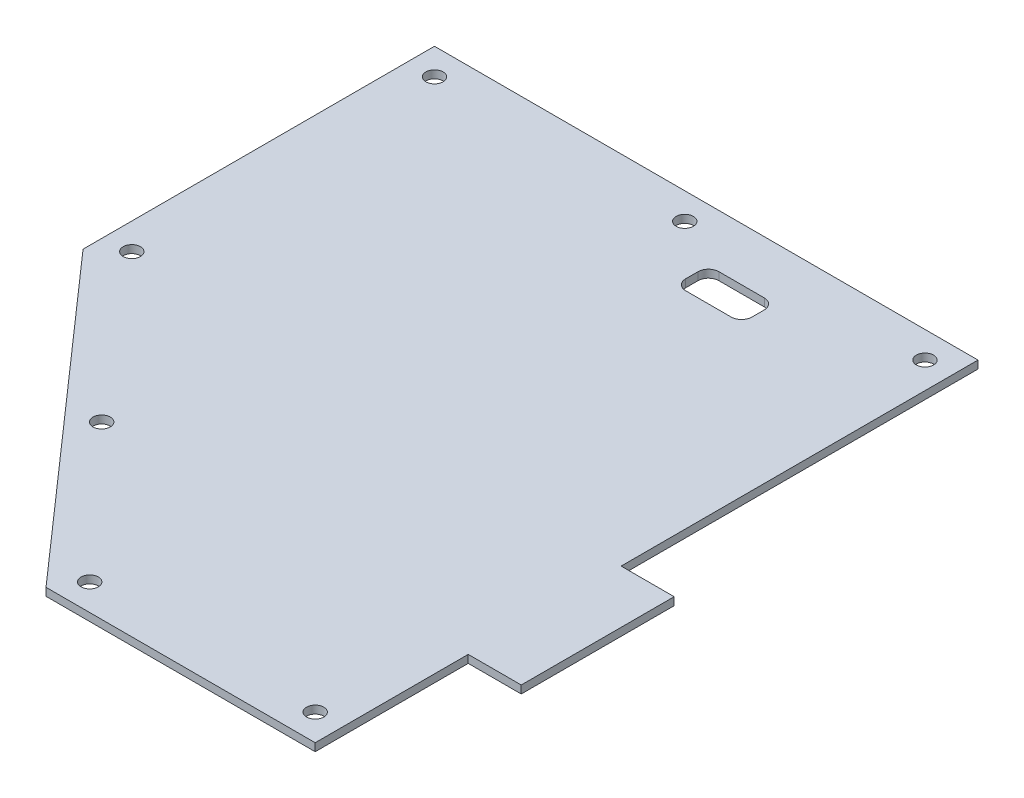
ISO-10303-21;
HEADER;
FILE_DESCRIPTION(('STEP AP214'),'2;1');
FILE_NAME('part.step','',(''),(''),'','','');
FILE_SCHEMA(('AUTOMOTIVE_DESIGN { 1 0 10303 214 1 1 1 1 }'));
ENDSEC;
DATA;
#1=APPLICATION_CONTEXT('core data for automotive mechanical design processes');
#2=APPLICATION_PROTOCOL_DEFINITION('international standard','automotive_design',2000,#1);
#3=PRODUCT_CONTEXT('',#1,'mechanical');
#4=PRODUCT('Part','Part','',(#3));
#5=PRODUCT_RELATED_PRODUCT_CATEGORY('part','',(#4));
#6=PRODUCT_DEFINITION_FORMATION('','',#4);
#7=PRODUCT_DEFINITION_CONTEXT('part definition',#1,'design');
#8=PRODUCT_DEFINITION('design','',#6,#7);
#9=PRODUCT_DEFINITION_SHAPE('','',#8);
#10=(LENGTH_UNIT() NAMED_UNIT(*) SI_UNIT(.MILLI.,.METRE.));
#11=(NAMED_UNIT(*) PLANE_ANGLE_UNIT() SI_UNIT($,.RADIAN.));
#12=(NAMED_UNIT(*) SI_UNIT($,.STERADIAN.) SOLID_ANGLE_UNIT());
#13=UNCERTAINTY_MEASURE_WITH_UNIT(LENGTH_MEASURE(1.E-05),#10,'distance_accuracy_value','');
#14=(GEOMETRIC_REPRESENTATION_CONTEXT(3) GLOBAL_UNCERTAINTY_ASSIGNED_CONTEXT((#13)) GLOBAL_UNIT_ASSIGNED_CONTEXT((#10,
#11,#12)) REPRESENTATION_CONTEXT('',''));
#15=CARTESIAN_POINT('',(0.,0.,0.));
#16=DIRECTION('',(0.,0.,1.));
#17=DIRECTION('',(1.,0.,0.));
#18=AXIS2_PLACEMENT_3D('',#15,#16,#17);
#19=CARTESIAN_POINT('',(0.,1.5,0.));
#20=DIRECTION('',(1.,0.,0.));
#21=DIRECTION('',(0.,0.,-1.));
#22=AXIS2_PLACEMENT_3D('',#19,#20,#21);
#23=PLANE('',#22);
#24=DIRECTION('',(0.,0.,1.));
#25=VECTOR('',#24,1.);
#26=CARTESIAN_POINT('',(0.,0.,0.));
#27=LINE('',#26,#25);
#28=CARTESIAN_POINT('',(0.,0.,0.));
#29=VERTEX_POINT('',#28);
#30=CARTESIAN_POINT('',(0.,0.,67.34));
#31=VERTEX_POINT('',#30);
#32=EDGE_CURVE('E178',#29,#31,#27,.T.);
#33=ORIENTED_EDGE('',*,*,#32,.T.);
#34=DIRECTION('',(0.,-1.,0.));
#35=VECTOR('',#34,1.);
#36=CARTESIAN_POINT('',(0.,1.5,67.34));
#37=LINE('',#36,#35);
#38=CARTESIAN_POINT('',(0.,1.5,67.34));
#39=VERTEX_POINT('',#38);
#40=EDGE_CURVE('E159',#39,#31,#37,.T.);
#41=ORIENTED_EDGE('',*,*,#40,.F.);
#42=DIRECTION('',(0.,0.,1.));
#43=VECTOR('',#42,1.);
#44=CARTESIAN_POINT('',(0.,1.5,0.));
#45=LINE('',#44,#43);
#46=CARTESIAN_POINT('',(0.,1.5,0.));
#47=VERTEX_POINT('',#46);
#48=EDGE_CURVE('E166',#47,#39,#45,.T.);
#49=ORIENTED_EDGE('',*,*,#48,.F.);
#50=DIRECTION('',(0.,-1.,0.));
#51=VECTOR('',#50,1.);
#52=CARTESIAN_POINT('',(0.,1.5,0.));
#53=LINE('',#52,#51);
#54=EDGE_CURVE('E296',#47,#29,#53,.T.);
#55=ORIENTED_EDGE('',*,*,#54,.T.);
#56=EDGE_LOOP('',(#33,#41,#49,#55));
#57=FACE_BOUND('',#56,.T.);
#58=ADVANCED_FACE('F36',(#57),#23,.F.);
#59=CARTESIAN_POINT('',(0.,1.5,67.34));
#60=DIRECTION('',(0.750341865315039,0.,-0.661049986881134));
#61=DIRECTION('',(-0.661049986881134,0.,-0.75034186531504));
#62=AXIS2_PLACEMENT_3D('',#59,#60,#61);
#63=PLANE('',#62);
#64=DIRECTION('',(0.661049986881134,0.,0.75034186531504));
#65=VECTOR('',#64,1.);
#66=CARTESIAN_POINT('',(0.,0.,67.34));
#67=LINE('',#66,#65);
#68=CARTESIAN_POINT('',(52.560084456919,0.,126.999681711199));
#69=VERTEX_POINT('',#68);
#70=EDGE_CURVE('E298',#31,#69,#67,.T.);
#71=ORIENTED_EDGE('',*,*,#70,.T.);
#72=DIRECTION('',(0.,-1.,0.));
#73=VECTOR('',#72,1.);
#74=CARTESIAN_POINT('',(52.560084456919,1.5,126.999681711199));
#75=LINE('',#74,#73);
#76=CARTESIAN_POINT('',(52.560084456919,1.5,126.999681711199));
#77=VERTEX_POINT('',#76);
#78=EDGE_CURVE('E162',#77,#69,#75,.T.);
#79=ORIENTED_EDGE('',*,*,#78,.F.);
#80=DIRECTION('',(0.661049986881134,0.,0.75034186531504));
#81=VECTOR('',#80,1.);
#82=CARTESIAN_POINT('',(0.,1.5,67.34));
#83=LINE('',#82,#81);
#84=EDGE_CURVE('E155',#39,#77,#83,.T.);
#85=ORIENTED_EDGE('',*,*,#84,.F.);
#86=ORIENTED_EDGE('',*,*,#40,.T.);
#87=EDGE_LOOP('',(#71,#79,#85,#86));
#88=FACE_BOUND('',#87,.T.);
#89=ADVANCED_FACE('F157',(#88),#63,.F.);
#90=CARTESIAN_POINT('',(104.140084456919,1.5,126.999681711199));
#91=DIRECTION('',(0.,0.,-1.));
#92=DIRECTION('',(-1.,0.,0.));
#93=AXIS2_PLACEMENT_3D('',#90,#91,#92);
#94=PLANE('',#93);
#95=DIRECTION('',(1.,0.,0.));
#96=VECTOR('',#95,1.);
#97=CARTESIAN_POINT('',(104.140084456919,0.,126.999681711199));
#98=LINE('',#97,#96);
#99=CARTESIAN_POINT('',(104.140084456919,0.,126.999681711199));
#100=VERTEX_POINT('',#99);
#101=EDGE_CURVE('E300',#69,#100,#98,.T.);
#102=ORIENTED_EDGE('',*,*,#101,.T.);
#103=DIRECTION('',(0.,-1.,0.));
#104=VECTOR('',#103,1.);
#105=CARTESIAN_POINT('',(104.140084456919,1.5,126.999681711199));
#106=LINE('',#105,#104);
#107=CARTESIAN_POINT('',(104.140084456919,1.5,126.999681711199));
#108=VERTEX_POINT('',#107);
#109=EDGE_CURVE('E183',#108,#100,#106,.T.);
#110=ORIENTED_EDGE('',*,*,#109,.F.);
#111=DIRECTION('',(1.,0.,0.));
#112=VECTOR('',#111,1.);
#113=CARTESIAN_POINT('',(104.140084456919,1.5,126.999681711199));
#114=LINE('',#113,#112);
#115=EDGE_CURVE('E165',#77,#108,#114,.T.);
#116=ORIENTED_EDGE('',*,*,#115,.F.);
#117=ORIENTED_EDGE('',*,*,#78,.T.);
#118=EDGE_LOOP('',(#102,#110,#116,#117));
#119=FACE_BOUND('',#118,.T.);
#120=ADVANCED_FACE('F352',(#119),#94,.F.);
#121=CARTESIAN_POINT('',(104.140084456919,1.5,97.6796817111988));
#122=DIRECTION('',(-1.,0.,0.));
#123=DIRECTION('',(0.,0.,1.));
#124=AXIS2_PLACEMENT_3D('',#121,#122,#123);
#125=PLANE('',#124);
#126=DIRECTION('',(0.,0.,-1.));
#127=VECTOR('',#126,1.);
#128=CARTESIAN_POINT('',(104.140084456919,0.,97.6796817111988));
#129=LINE('',#128,#127);
#130=CARTESIAN_POINT('',(104.140084456919,0.,97.6796817111988));
#131=VERTEX_POINT('',#130);
#132=EDGE_CURVE('E302',#100,#131,#129,.T.);
#133=ORIENTED_EDGE('',*,*,#132,.T.);
#134=DIRECTION('',(0.,-1.,0.));
#135=VECTOR('',#134,1.);
#136=CARTESIAN_POINT('',(104.140084456919,1.5,97.6796817111988));
#137=LINE('',#136,#135);
#138=CARTESIAN_POINT('',(104.140084456919,1.5,97.6796817111988));
#139=VERTEX_POINT('',#138);
#140=EDGE_CURVE('E326',#139,#131,#137,.T.);
#141=ORIENTED_EDGE('',*,*,#140,.F.);
#142=DIRECTION('',(0.,0.,-1.));
#143=VECTOR('',#142,1.);
#144=CARTESIAN_POINT('',(104.140084456919,1.5,97.6796817111988));
#145=LINE('',#144,#143);
#146=EDGE_CURVE('E285',#108,#139,#145,.T.);
#147=ORIENTED_EDGE('',*,*,#146,.F.);
#148=ORIENTED_EDGE('',*,*,#109,.T.);
#149=EDGE_LOOP('',(#133,#141,#147,#148));
#150=FACE_BOUND('',#149,.T.);
#151=ADVANCED_FACE('F333',(#150),#125,.F.);
#152=CARTESIAN_POINT('',(104.140084456919,1.5,97.6796817111988));
#153=DIRECTION('',(0.,0.,-1.));
#154=DIRECTION('',(-1.,0.,0.));
#155=AXIS2_PLACEMENT_3D('',#152,#153,#154);
#156=PLANE('',#155);
#157=DIRECTION('',(1.,0.,0.));
#158=VECTOR('',#157,1.);
#159=CARTESIAN_POINT('',(104.140084456919,0.,97.6796817111988));
#160=LINE('',#159,#158);
#161=CARTESIAN_POINT('',(114.300084456919,0.,97.6796817111988));
#162=VERTEX_POINT('',#161);
#163=EDGE_CURVE('E304',#131,#162,#160,.T.);
#164=ORIENTED_EDGE('',*,*,#163,.T.);
#165=DIRECTION('',(0.,-1.,0.));
#166=VECTOR('',#165,1.);
#167=CARTESIAN_POINT('',(114.300084456919,1.5,97.6796817111988));
#168=LINE('',#167,#166);
#169=CARTESIAN_POINT('',(114.300084456919,1.5,97.6796817111988));
#170=VERTEX_POINT('',#169);
#171=EDGE_CURVE('E323',#170,#162,#168,.T.);
#172=ORIENTED_EDGE('',*,*,#171,.F.);
#173=DIRECTION('',(1.,0.,0.));
#174=VECTOR('',#173,1.);
#175=CARTESIAN_POINT('',(104.140084456919,1.5,97.6796817111988));
#176=LINE('',#175,#174);
#177=EDGE_CURVE('E287',#139,#170,#176,.T.);
#178=ORIENTED_EDGE('',*,*,#177,.F.);
#179=ORIENTED_EDGE('',*,*,#140,.T.);
#180=EDGE_LOOP('',(#164,#172,#178,#179));
#181=FACE_BOUND('',#180,.T.);
#182=ADVANCED_FACE('F344',(#181),#156,.F.);
#183=CARTESIAN_POINT('',(114.300084456919,1.5,97.6796817111988));
#184=DIRECTION('',(-1.,0.,0.));
#185=DIRECTION('',(0.,0.,1.));
#186=AXIS2_PLACEMENT_3D('',#183,#184,#185);
#187=PLANE('',#186);
#188=DIRECTION('',(0.,0.,-1.));
#189=VECTOR('',#188,1.);
#190=CARTESIAN_POINT('',(114.300084456919,0.,97.6796817111988));
#191=LINE('',#190,#189);
#192=CARTESIAN_POINT('',(114.300084456919,0.,68.3796817111988));
#193=VERTEX_POINT('',#192);
#194=EDGE_CURVE('E306',#162,#193,#191,.T.);
#195=ORIENTED_EDGE('',*,*,#194,.T.);
#196=DIRECTION('',(0.,-1.,0.));
#197=VECTOR('',#196,1.);
#198=CARTESIAN_POINT('',(114.300084456919,1.5,68.3796817111988));
#199=LINE('',#198,#197);
#200=CARTESIAN_POINT('',(114.300084456919,1.5,68.3796817111988));
#201=VERTEX_POINT('',#200);
#202=EDGE_CURVE('E320',#201,#193,#199,.T.);
#203=ORIENTED_EDGE('',*,*,#202,.F.);
#204=DIRECTION('',(0.,0.,-1.));
#205=VECTOR('',#204,1.);
#206=CARTESIAN_POINT('',(114.300084456919,1.5,97.6796817111988));
#207=LINE('',#206,#205);
#208=EDGE_CURVE('E289',#170,#201,#207,.T.);
#209=ORIENTED_EDGE('',*,*,#208,.F.);
#210=ORIENTED_EDGE('',*,*,#171,.T.);
#211=EDGE_LOOP('',(#195,#203,#209,#210));
#212=FACE_BOUND('',#211,.T.);
#213=ADVANCED_FACE('F348',(#212),#187,.F.);
#214=CARTESIAN_POINT('',(104.140084456919,1.5,68.3796817111988));
#215=DIRECTION('',(0.,0.,1.));
#216=DIRECTION('',(1.,0.,0.));
#217=AXIS2_PLACEMENT_3D('',#214,#215,#216);
#218=PLANE('',#217);
#219=DIRECTION('',(-1.,0.,0.));
#220=VECTOR('',#219,1.);
#221=CARTESIAN_POINT('',(104.140084456919,0.,68.3796817111988));
#222=LINE('',#221,#220);
#223=CARTESIAN_POINT('',(104.140084456919,0.,68.3796817111988));
#224=VERTEX_POINT('',#223);
#225=EDGE_CURVE('E308',#193,#224,#222,.T.);
#226=ORIENTED_EDGE('',*,*,#225,.T.);
#227=DIRECTION('',(0.,-1.,0.));
#228=VECTOR('',#227,1.);
#229=CARTESIAN_POINT('',(104.140084456919,1.5,68.3796817111988));
#230=LINE('',#229,#228);
#231=CARTESIAN_POINT('',(104.140084456919,1.5,68.3796817111988));
#232=VERTEX_POINT('',#231);
#233=EDGE_CURVE('E317',#232,#224,#230,.T.);
#234=ORIENTED_EDGE('',*,*,#233,.F.);
#235=DIRECTION('',(-1.,0.,0.));
#236=VECTOR('',#235,1.);
#237=CARTESIAN_POINT('',(104.140084456919,1.5,68.3796817111988));
#238=LINE('',#237,#236);
#239=EDGE_CURVE('E291',#201,#232,#238,.T.);
#240=ORIENTED_EDGE('',*,*,#239,.F.);
#241=ORIENTED_EDGE('',*,*,#202,.T.);
#242=EDGE_LOOP('',(#226,#234,#240,#241));
#243=FACE_BOUND('',#242,.T.);
#244=ADVANCED_FACE('F448',(#243),#218,.F.);
#245=CARTESIAN_POINT('',(104.14,1.5,0.));
#246=DIRECTION('',(-0.999999999999237,0.,1.2351171705755E-06));
#247=DIRECTION('',(1.2351171705755E-06,0.,0.999999999999237));
#248=AXIS2_PLACEMENT_3D('',#245,#246,#247);
#249=PLANE('',#248);
#250=DIRECTION('',(-1.2351171705755E-06,0.,-0.999999999999237));
#251=VECTOR('',#250,1.);
#252=CARTESIAN_POINT('',(104.14,0.,0.));
#253=LINE('',#252,#251);
#254=CARTESIAN_POINT('',(104.14,0.,0.));
#255=VERTEX_POINT('',#254);
#256=EDGE_CURVE('E310',#224,#255,#253,.T.);
#257=ORIENTED_EDGE('',*,*,#256,.T.);
#258=DIRECTION('',(0.,-1.,0.));
#259=VECTOR('',#258,1.);
#260=CARTESIAN_POINT('',(104.14,1.5,0.));
#261=LINE('',#260,#259);
#262=CARTESIAN_POINT('',(104.14,1.5,0.));
#263=VERTEX_POINT('',#262);
#264=EDGE_CURVE('E314',#263,#255,#261,.T.);
#265=ORIENTED_EDGE('',*,*,#264,.F.);
#266=DIRECTION('',(-1.2351171705755E-06,0.,-0.999999999999237));
#267=VECTOR('',#266,1.);
#268=CARTESIAN_POINT('',(104.14,1.5,0.));
#269=LINE('',#268,#267);
#270=EDGE_CURVE('E293',#232,#263,#269,.T.);
#271=ORIENTED_EDGE('',*,*,#270,.F.);
#272=ORIENTED_EDGE('',*,*,#233,.T.);
#273=EDGE_LOOP('',(#257,#265,#271,#272));
#274=FACE_BOUND('',#273,.T.);
#275=ADVANCED_FACE('F444',(#274),#249,.F.);
#276=CARTESIAN_POINT('',(0.,1.5,0.));
#277=DIRECTION('',(0.,0.,1.));
#278=DIRECTION('',(1.,0.,0.));
#279=AXIS2_PLACEMENT_3D('',#276,#277,#278);
#280=PLANE('',#279);
#281=DIRECTION('',(-1.,0.,0.));
#282=VECTOR('',#281,1.);
#283=CARTESIAN_POINT('',(0.,0.,0.));
#284=LINE('',#283,#282);
#285=EDGE_CURVE('E175',#255,#29,#284,.T.);
#286=ORIENTED_EDGE('',*,*,#285,.T.);
#287=ORIENTED_EDGE('',*,*,#54,.F.);
#288=DIRECTION('',(-1.,0.,0.));
#289=VECTOR('',#288,1.);
#290=CARTESIAN_POINT('',(0.,1.5,0.));
#291=LINE('',#290,#289);
#292=EDGE_CURVE('E171',#263,#47,#291,.T.);
#293=ORIENTED_EDGE('',*,*,#292,.F.);
#294=ORIENTED_EDGE('',*,*,#264,.T.);
#295=EDGE_LOOP('',(#286,#287,#293,#294));
#296=FACE_BOUND('',#295,.T.);
#297=ADVANCED_FACE('F439',(#296),#280,.F.);
#298=CARTESIAN_POINT('',(0.,1.5,0.));
#299=DIRECTION('',(0.,-1.,0.));
#300=DIRECTION('',(0.,0.,-1.));
#301=AXIS2_PLACEMENT_3D('',#298,#299,#300);
#302=PLANE('',#301);
#303=DIRECTION('',(0.,0.,1.));
#304=VECTOR('',#303,1.);
#305=CARTESIAN_POINT('',(62.65,1.5,10.16));
#306=LINE('',#305,#304);
#307=CARTESIAN_POINT('',(62.65,1.5,12.16));
#308=VERTEX_POINT('',#307);
#309=CARTESIAN_POINT('',(62.65,1.5,14.51));
#310=VERTEX_POINT('',#309);
#311=EDGE_CURVE('E219',#308,#310,#306,.T.);
#312=ORIENTED_EDGE('',*,*,#311,.F.);
#313=CARTESIAN_POINT('',(64.65,1.5,12.16));
#314=DIRECTION('',(0.,-1.,0.));
#315=DIRECTION('',(0.,0.,-1.));
#316=AXIS2_PLACEMENT_3D('',#313,#314,#315);
#317=CIRCLE('',#316,2.);
#318=CARTESIAN_POINT('',(64.65,1.5,10.16));
#319=VERTEX_POINT('',#318);
#320=EDGE_CURVE('E203',#308,#319,#317,.T.);
#321=ORIENTED_EDGE('',*,*,#320,.T.);
#322=DIRECTION('',(-1.,0.,0.));
#323=VECTOR('',#322,1.);
#324=CARTESIAN_POINT('',(62.65,1.5,10.16));
#325=LINE('',#324,#323);
#326=CARTESIAN_POINT('',(73.35,1.5,10.16));
#327=VERTEX_POINT('',#326);
#328=EDGE_CURVE('E228',#327,#319,#325,.T.);
#329=ORIENTED_EDGE('',*,*,#328,.F.);
#330=CARTESIAN_POINT('',(73.35,1.5,12.16));
#331=DIRECTION('',(0.,-1.,0.));
#332=DIRECTION('',(0.,0.,-1.));
#333=AXIS2_PLACEMENT_3D('',#330,#331,#332);
#334=CIRCLE('',#333,2.);
#335=CARTESIAN_POINT('',(75.35,1.5,12.16));
#336=VERTEX_POINT('',#335);
#337=EDGE_CURVE('E207',#327,#336,#334,.T.);
#338=ORIENTED_EDGE('',*,*,#337,.T.);
#339=DIRECTION('',(0.,0.,-1.));
#340=VECTOR('',#339,1.);
#341=CARTESIAN_POINT('',(75.35,1.5,10.16));
#342=LINE('',#341,#340);
#343=CARTESIAN_POINT('',(75.35,1.5,14.51));
#344=VERTEX_POINT('',#343);
#345=EDGE_CURVE('E388',#344,#336,#342,.T.);
#346=ORIENTED_EDGE('',*,*,#345,.F.);
#347=CARTESIAN_POINT('',(73.35,1.5,14.51));
#348=DIRECTION('',(0.,-1.,0.));
#349=DIRECTION('',(0.,0.,-1.));
#350=AXIS2_PLACEMENT_3D('',#347,#348,#349);
#351=CIRCLE('',#350,2.);
#352=CARTESIAN_POINT('',(73.35,1.5,16.51));
#353=VERTEX_POINT('',#352);
#354=EDGE_CURVE('E211',#344,#353,#351,.T.);
#355=ORIENTED_EDGE('',*,*,#354,.T.);
#356=DIRECTION('',(1.,0.,0.));
#357=VECTOR('',#356,1.);
#358=CARTESIAN_POINT('',(62.65,1.5,16.51));
#359=LINE('',#358,#357);
#360=CARTESIAN_POINT('',(64.65,1.5,16.51));
#361=VERTEX_POINT('',#360);
#362=EDGE_CURVE('E220',#361,#353,#359,.T.);
#363=ORIENTED_EDGE('',*,*,#362,.F.);
#364=CARTESIAN_POINT('',(64.65,1.5,14.51));
#365=DIRECTION('',(0.,-1.,0.));
#366=DIRECTION('',(0.,0.,-1.));
#367=AXIS2_PLACEMENT_3D('',#364,#365,#366);
#368=CIRCLE('',#367,2.);
#369=EDGE_CURVE('E44',#361,#310,#368,.T.);
#370=ORIENTED_EDGE('',*,*,#369,.T.);
#371=EDGE_LOOP('',(#312,#321,#329,#338,#346,#355,#363,#370));
#372=FACE_BOUND('',#371,.T.);
#373=CARTESIAN_POINT('',(5.08,1.5,5.08));
#374=DIRECTION('',(0.,1.,0.));
#375=DIRECTION('',(0.,0.,1.));
#376=AXIS2_PLACEMENT_3D('',#373,#374,#375);
#377=CIRCLE('',#376,1.64999999999999);
#378=CARTESIAN_POINT('',(5.08,1.5,6.72999999999999));
#379=VERTEX_POINT('',#378);
#380=EDGE_CURVE('E237',#379,#379,#377,.T.);
#381=ORIENTED_EDGE('',*,*,#380,.F.);
#382=EDGE_LOOP('',(#381));
#383=FACE_BOUND('',#382,.T.);
#384=CARTESIAN_POINT('',(53.03,1.5,5.08));
#385=DIRECTION('',(0.,1.,0.));
#386=DIRECTION('',(0.,0.,1.));
#387=AXIS2_PLACEMENT_3D('',#384,#385,#386);
#388=CIRCLE('',#387,1.64999999999999);
#389=CARTESIAN_POINT('',(53.03,1.5,6.72999999999999));
#390=VERTEX_POINT('',#389);
#391=EDGE_CURVE('E248',#390,#390,#388,.T.);
#392=ORIENTED_EDGE('',*,*,#391,.F.);
#393=EDGE_LOOP('',(#392));
#394=FACE_BOUND('',#393,.T.);
#395=CARTESIAN_POINT('',(99.0600062743914,1.5,5.08));
#396=DIRECTION('',(0.,1.,0.));
#397=DIRECTION('',(0.,0.,1.));
#398=AXIS2_PLACEMENT_3D('',#395,#396,#397);
#399=CIRCLE('',#398,1.64999999999998);
#400=CARTESIAN_POINT('',(99.0600062743914,1.5,6.72999999999999));
#401=VERTEX_POINT('',#400);
#402=EDGE_CURVE('E254',#401,#401,#399,.T.);
#403=ORIENTED_EDGE('',*,*,#402,.F.);
#404=EDGE_LOOP('',(#403));
#405=FACE_BOUND('',#404,.T.);
#406=CARTESIAN_POINT('',(99.060084456919,1.5,121.919681711199));
#407=DIRECTION('',(0.,1.,0.));
#408=DIRECTION('',(0.,0.,1.));
#409=AXIS2_PLACEMENT_3D('',#406,#407,#408);
#410=CIRCLE('',#409,1.64999999999998);
#411=CARTESIAN_POINT('',(99.060084456919,1.5,123.569681711199));
#412=VERTEX_POINT('',#411);
#413=EDGE_CURVE('E260',#412,#412,#410,.T.);
#414=ORIENTED_EDGE('',*,*,#413,.F.);
#415=EDGE_LOOP('',(#414));
#416=FACE_BOUND('',#415,.T.);
#417=CARTESIAN_POINT('',(55.850084456919,1.5,121.919681711199));
#418=DIRECTION('',(0.,1.,0.));
#419=DIRECTION('',(0.,0.,1.));
#420=AXIS2_PLACEMENT_3D('',#417,#418,#419);
#421=CIRCLE('',#420,1.64999999999999);
#422=CARTESIAN_POINT('',(55.850084456919,1.5,123.569681711199));
#423=VERTEX_POINT('',#422);
#424=EDGE_CURVE('E266',#423,#423,#421,.T.);
#425=ORIENTED_EDGE('',*,*,#424,.F.);
#426=EDGE_LOOP('',(#425));
#427=FACE_BOUND('',#426,.T.);
#428=CARTESIAN_POINT('',(30.4656304033941,1.5,94.2360567244944));
#429=DIRECTION('',(0.,1.,0.));
#430=DIRECTION('',(0.,0.,1.));
#431=AXIS2_PLACEMENT_3D('',#428,#429,#430);
#432=CIRCLE('',#431,1.64999999999999);
#433=CARTESIAN_POINT('',(30.4656304033941,1.5,95.8860567244944));
#434=VERTEX_POINT('',#433);
#435=EDGE_CURVE('E272',#434,#434,#432,.T.);
#436=ORIENTED_EDGE('',*,*,#435,.F.);
#437=EDGE_LOOP('',(#436));
#438=FACE_BOUND('',#437,.T.);
#439=CARTESIAN_POINT('',(5.08,1.5,63.08));
#440=DIRECTION('',(0.,1.,0.));
#441=DIRECTION('',(0.,0.,1.));
#442=AXIS2_PLACEMENT_3D('',#439,#440,#441);
#443=CIRCLE('',#442,1.64999999999999);
#444=CARTESIAN_POINT('',(5.08,1.5,64.73));
#445=VERTEX_POINT('',#444);
#446=EDGE_CURVE('E278',#445,#445,#443,.T.);
#447=ORIENTED_EDGE('',*,*,#446,.F.);
#448=EDGE_LOOP('',(#447));
#449=FACE_BOUND('',#448,.T.);
#450=ORIENTED_EDGE('',*,*,#48,.T.);
#451=ORIENTED_EDGE('',*,*,#84,.T.);
#452=ORIENTED_EDGE('',*,*,#115,.T.);
#453=ORIENTED_EDGE('',*,*,#146,.T.);
#454=ORIENTED_EDGE('',*,*,#177,.T.);
#455=ORIENTED_EDGE('',*,*,#208,.T.);
#456=ORIENTED_EDGE('',*,*,#239,.T.);
#457=ORIENTED_EDGE('',*,*,#270,.T.);
#458=ORIENTED_EDGE('',*,*,#292,.T.);
#459=EDGE_LOOP('',(#450,#451,#452,#453,#454,#455,#456,#457,#458));
#460=FACE_BOUND('',#459,.T.);
#461=ADVANCED_FACE('F169',(#372,#383,#394,#405,#416,#427,#438,#449,#460),#302,.F.);
#462=CARTESIAN_POINT('',(0.,0.,0.));
#463=DIRECTION('',(0.,-1.,0.));
#464=DIRECTION('',(0.,0.,-1.));
#465=AXIS2_PLACEMENT_3D('',#462,#463,#464);
#466=PLANE('',#465);
#467=DIRECTION('',(0.,0.,-1.));
#468=VECTOR('',#467,1.);
#469=CARTESIAN_POINT('',(75.35,0.,10.16));
#470=LINE('',#469,#468);
#471=CARTESIAN_POINT('',(75.35,0.,14.51));
#472=VERTEX_POINT('',#471);
#473=CARTESIAN_POINT('',(75.35,0.,12.16));
#474=VERTEX_POINT('',#473);
#475=EDGE_CURVE('E233',#472,#474,#470,.T.);
#476=ORIENTED_EDGE('',*,*,#475,.T.);
#477=CARTESIAN_POINT('',(73.35,0.,12.16));
#478=DIRECTION('',(0.,-1.,0.));
#479=DIRECTION('',(0.,0.,-1.));
#480=AXIS2_PLACEMENT_3D('',#477,#478,#479);
#481=CIRCLE('',#480,2.);
#482=CARTESIAN_POINT('',(73.35,0.,10.16));
#483=VERTEX_POINT('',#482);
#484=EDGE_CURVE('E209',#474,#483,#481,.F.);
#485=ORIENTED_EDGE('',*,*,#484,.T.);
#486=DIRECTION('',(-1.,0.,0.));
#487=VECTOR('',#486,1.);
#488=CARTESIAN_POINT('',(62.65,0.,10.16));
#489=LINE('',#488,#487);
#490=CARTESIAN_POINT('',(64.65,0.,10.16));
#491=VERTEX_POINT('',#490);
#492=EDGE_CURVE('E239',#483,#491,#489,.T.);
#493=ORIENTED_EDGE('',*,*,#492,.T.);
#494=CARTESIAN_POINT('',(64.65,0.,12.16));
#495=DIRECTION('',(0.,-1.,0.));
#496=DIRECTION('',(0.,0.,-1.));
#497=AXIS2_PLACEMENT_3D('',#494,#495,#496);
#498=CIRCLE('',#497,2.);
#499=CARTESIAN_POINT('',(62.65,0.,12.16));
#500=VERTEX_POINT('',#499);
#501=EDGE_CURVE('E205',#491,#500,#498,.F.);
#502=ORIENTED_EDGE('',*,*,#501,.T.);
#503=DIRECTION('',(0.,0.,1.));
#504=VECTOR('',#503,1.);
#505=CARTESIAN_POINT('',(62.65,0.,10.16));
#506=LINE('',#505,#504);
#507=CARTESIAN_POINT('',(62.65,0.,14.51));
#508=VERTEX_POINT('',#507);
#509=EDGE_CURVE('E234',#500,#508,#506,.T.);
#510=ORIENTED_EDGE('',*,*,#509,.T.);
#511=CARTESIAN_POINT('',(64.65,0.,14.51));
#512=DIRECTION('',(0.,-1.,0.));
#513=DIRECTION('',(0.,0.,-1.));
#514=AXIS2_PLACEMENT_3D('',#511,#512,#513);
#515=CIRCLE('',#514,2.);
#516=CARTESIAN_POINT('',(64.65,0.,16.51));
#517=VERTEX_POINT('',#516);
#518=EDGE_CURVE('E11',#508,#517,#515,.F.);
#519=ORIENTED_EDGE('',*,*,#518,.T.);
#520=DIRECTION('',(1.,0.,0.));
#521=VECTOR('',#520,1.);
#522=CARTESIAN_POINT('',(62.65,0.,16.51));
#523=LINE('',#522,#521);
#524=CARTESIAN_POINT('',(73.35,0.,16.51));
#525=VERTEX_POINT('',#524);
#526=EDGE_CURVE('E231',#517,#525,#523,.T.);
#527=ORIENTED_EDGE('',*,*,#526,.T.);
#528=CARTESIAN_POINT('',(73.35,0.,14.51));
#529=DIRECTION('',(0.,-1.,0.));
#530=DIRECTION('',(0.,0.,-1.));
#531=AXIS2_PLACEMENT_3D('',#528,#529,#530);
#532=CIRCLE('',#531,2.);
#533=EDGE_CURVE('E213',#525,#472,#532,.F.);
#534=ORIENTED_EDGE('',*,*,#533,.T.);
#535=EDGE_LOOP('',(#476,#485,#493,#502,#510,#519,#527,#534));
#536=FACE_BOUND('',#535,.T.);
#537=CARTESIAN_POINT('',(5.08,0.,5.08));
#538=DIRECTION('',(0.,1.,0.));
#539=DIRECTION('',(0.,0.,1.));
#540=AXIS2_PLACEMENT_3D('',#537,#538,#539);
#541=CIRCLE('',#540,1.65);
#542=CARTESIAN_POINT('',(5.08,0.,6.73));
#543=VERTEX_POINT('',#542);
#544=EDGE_CURVE('E245',#543,#543,#541,.T.);
#545=ORIENTED_EDGE('',*,*,#544,.T.);
#546=EDGE_LOOP('',(#545));
#547=FACE_BOUND('',#546,.T.);
#548=CARTESIAN_POINT('',(53.03,0.,5.08));
#549=DIRECTION('',(0.,1.,0.));
#550=DIRECTION('',(0.,0.,1.));
#551=AXIS2_PLACEMENT_3D('',#548,#549,#550);
#552=CIRCLE('',#551,1.65);
#553=CARTESIAN_POINT('',(53.03,0.,6.73));
#554=VERTEX_POINT('',#553);
#555=EDGE_CURVE('E251',#554,#554,#552,.T.);
#556=ORIENTED_EDGE('',*,*,#555,.T.);
#557=EDGE_LOOP('',(#556));
#558=FACE_BOUND('',#557,.T.);
#559=CARTESIAN_POINT('',(99.0600062743914,0.,5.08));
#560=DIRECTION('',(0.,1.,0.));
#561=DIRECTION('',(0.,0.,1.));
#562=AXIS2_PLACEMENT_3D('',#559,#560,#561);
#563=CIRCLE('',#562,1.65);
#564=CARTESIAN_POINT('',(99.0600062743914,0.,6.73));
#565=VERTEX_POINT('',#564);
#566=EDGE_CURVE('E257',#565,#565,#563,.T.);
#567=ORIENTED_EDGE('',*,*,#566,.T.);
#568=EDGE_LOOP('',(#567));
#569=FACE_BOUND('',#568,.T.);
#570=CARTESIAN_POINT('',(99.060084456919,0.,121.919681711199));
#571=DIRECTION('',(0.,1.,0.));
#572=DIRECTION('',(0.,0.,1.));
#573=AXIS2_PLACEMENT_3D('',#570,#571,#572);
#574=CIRCLE('',#573,1.65);
#575=CARTESIAN_POINT('',(99.060084456919,0.,123.569681711199));
#576=VERTEX_POINT('',#575);
#577=EDGE_CURVE('E263',#576,#576,#574,.T.);
#578=ORIENTED_EDGE('',*,*,#577,.T.);
#579=EDGE_LOOP('',(#578));
#580=FACE_BOUND('',#579,.T.);
#581=CARTESIAN_POINT('',(55.850084456919,0.,121.919681711199));
#582=DIRECTION('',(0.,1.,0.));
#583=DIRECTION('',(0.,0.,1.));
#584=AXIS2_PLACEMENT_3D('',#581,#582,#583);
#585=CIRCLE('',#584,1.65);
#586=CARTESIAN_POINT('',(55.850084456919,0.,123.569681711199));
#587=VERTEX_POINT('',#586);
#588=EDGE_CURVE('E269',#587,#587,#585,.T.);
#589=ORIENTED_EDGE('',*,*,#588,.T.);
#590=EDGE_LOOP('',(#589));
#591=FACE_BOUND('',#590,.T.);
#592=CARTESIAN_POINT('',(30.4656304033941,0.,94.2360567244944));
#593=DIRECTION('',(0.,1.,0.));
#594=DIRECTION('',(0.,0.,1.));
#595=AXIS2_PLACEMENT_3D('',#592,#593,#594);
#596=CIRCLE('',#595,1.65);
#597=CARTESIAN_POINT('',(30.4656304033941,0.,95.8860567244944));
#598=VERTEX_POINT('',#597);
#599=EDGE_CURVE('E275',#598,#598,#596,.T.);
#600=ORIENTED_EDGE('',*,*,#599,.T.);
#601=EDGE_LOOP('',(#600));
#602=FACE_BOUND('',#601,.T.);
#603=CARTESIAN_POINT('',(5.08,0.,63.08));
#604=DIRECTION('',(0.,1.,0.));
#605=DIRECTION('',(0.,0.,1.));
#606=AXIS2_PLACEMENT_3D('',#603,#604,#605);
#607=CIRCLE('',#606,1.65);
#608=CARTESIAN_POINT('',(5.08,0.,64.73));
#609=VERTEX_POINT('',#608);
#610=EDGE_CURVE('E281',#609,#609,#607,.T.);
#611=ORIENTED_EDGE('',*,*,#610,.T.);
#612=EDGE_LOOP('',(#611));
#613=FACE_BOUND('',#612,.T.);
#614=ORIENTED_EDGE('',*,*,#32,.F.);
#615=ORIENTED_EDGE('',*,*,#285,.F.);
#616=ORIENTED_EDGE('',*,*,#256,.F.);
#617=ORIENTED_EDGE('',*,*,#225,.F.);
#618=ORIENTED_EDGE('',*,*,#194,.F.);
#619=ORIENTED_EDGE('',*,*,#163,.F.);
#620=ORIENTED_EDGE('',*,*,#132,.F.);
#621=ORIENTED_EDGE('',*,*,#101,.F.);
#622=ORIENTED_EDGE('',*,*,#70,.F.);
#623=EDGE_LOOP('',(#614,#615,#616,#617,#618,#619,#620,#621,#622));
#624=FACE_BOUND('',#623,.T.);
#625=ADVANCED_FACE('F339',(#536,#547,#558,#569,#580,#591,#602,#613,#624),#466,.T.);
#626=CARTESIAN_POINT('',(5.08,1.5,63.08));
#627=DIRECTION('',(0.,1.,0.));
#628=DIRECTION('',(0.,0.,1.));
#629=AXIS2_PLACEMENT_3D('',#626,#627,#628);
#630=CYLINDRICAL_SURFACE('',#629,1.64999999999999);
#631=ORIENTED_EDGE('',*,*,#610,.F.);
#632=EDGE_LOOP('',(#631));
#633=FACE_BOUND('',#632,.T.);
#634=ORIENTED_EDGE('',*,*,#446,.T.);
#635=EDGE_LOOP('',(#634));
#636=FACE_BOUND('',#635,.T.);
#637=ADVANCED_FACE('F432',(#633,#636),#630,.F.);
#638=CARTESIAN_POINT('',(30.4656304033941,1.5,94.2360567244944));
#639=DIRECTION('',(0.,1.,0.));
#640=DIRECTION('',(0.,0.,1.));
#641=AXIS2_PLACEMENT_3D('',#638,#639,#640);
#642=CYLINDRICAL_SURFACE('',#641,1.64999999999999);
#643=ORIENTED_EDGE('',*,*,#599,.F.);
#644=EDGE_LOOP('',(#643));
#645=FACE_BOUND('',#644,.T.);
#646=ORIENTED_EDGE('',*,*,#435,.T.);
#647=EDGE_LOOP('',(#646));
#648=FACE_BOUND('',#647,.T.);
#649=ADVANCED_FACE('F428',(#645,#648),#642,.F.);
#650=CARTESIAN_POINT('',(55.850084456919,1.5,121.919681711199));
#651=DIRECTION('',(0.,1.,0.));
#652=DIRECTION('',(0.,0.,1.));
#653=AXIS2_PLACEMENT_3D('',#650,#651,#652);
#654=CYLINDRICAL_SURFACE('',#653,1.65);
#655=ORIENTED_EDGE('',*,*,#588,.F.);
#656=EDGE_LOOP('',(#655));
#657=FACE_BOUND('',#656,.T.);
#658=ORIENTED_EDGE('',*,*,#424,.T.);
#659=EDGE_LOOP('',(#658));
#660=FACE_BOUND('',#659,.T.);
#661=ADVANCED_FACE('F424',(#657,#660),#654,.F.);
#662=CARTESIAN_POINT('',(99.060084456919,1.5,121.919681711199));
#663=DIRECTION('',(0.,1.,0.));
#664=DIRECTION('',(0.,0.,1.));
#665=AXIS2_PLACEMENT_3D('',#662,#663,#664);
#666=CYLINDRICAL_SURFACE('',#665,1.64999999999999);
#667=ORIENTED_EDGE('',*,*,#577,.F.);
#668=EDGE_LOOP('',(#667));
#669=FACE_BOUND('',#668,.T.);
#670=ORIENTED_EDGE('',*,*,#413,.T.);
#671=EDGE_LOOP('',(#670));
#672=FACE_BOUND('',#671,.T.);
#673=ADVANCED_FACE('F420',(#669,#672),#666,.F.);
#674=CARTESIAN_POINT('',(99.0600062743914,1.5,5.08));
#675=DIRECTION('',(0.,1.,0.));
#676=DIRECTION('',(0.,0.,1.));
#677=AXIS2_PLACEMENT_3D('',#674,#675,#676);
#678=CYLINDRICAL_SURFACE('',#677,1.64999999999999);
#679=ORIENTED_EDGE('',*,*,#566,.F.);
#680=EDGE_LOOP('',(#679));
#681=FACE_BOUND('',#680,.T.);
#682=ORIENTED_EDGE('',*,*,#402,.T.);
#683=EDGE_LOOP('',(#682));
#684=FACE_BOUND('',#683,.T.);
#685=ADVANCED_FACE('F416',(#681,#684),#678,.F.);
#686=CARTESIAN_POINT('',(53.03,1.5,5.08));
#687=DIRECTION('',(0.,1.,0.));
#688=DIRECTION('',(0.,0.,1.));
#689=AXIS2_PLACEMENT_3D('',#686,#687,#688);
#690=CYLINDRICAL_SURFACE('',#689,1.65);
#691=ORIENTED_EDGE('',*,*,#555,.F.);
#692=EDGE_LOOP('',(#691));
#693=FACE_BOUND('',#692,.T.);
#694=ORIENTED_EDGE('',*,*,#391,.T.);
#695=EDGE_LOOP('',(#694));
#696=FACE_BOUND('',#695,.T.);
#697=ADVANCED_FACE('F409',(#693,#696),#690,.F.);
#698=CARTESIAN_POINT('',(5.08,1.5,5.08));
#699=DIRECTION('',(0.,1.,0.));
#700=DIRECTION('',(0.,0.,1.));
#701=AXIS2_PLACEMENT_3D('',#698,#699,#700);
#702=CYLINDRICAL_SURFACE('',#701,1.64999999999999);
#703=ORIENTED_EDGE('',*,*,#544,.F.);
#704=EDGE_LOOP('',(#703));
#705=FACE_BOUND('',#704,.T.);
#706=ORIENTED_EDGE('',*,*,#380,.T.);
#707=EDGE_LOOP('',(#706));
#708=FACE_BOUND('',#707,.T.);
#709=ADVANCED_FACE('F402',(#705,#708),#702,.F.);
#710=CARTESIAN_POINT('',(62.65,-14.1990316571237,10.16));
#711=DIRECTION('',(0.,0.,-1.));
#712=DIRECTION('',(-1.,0.,0.));
#713=AXIS2_PLACEMENT_3D('',#710,#711,#712);
#714=PLANE('',#713);
#715=ORIENTED_EDGE('',*,*,#328,.T.);
#716=DIRECTION('',(0.,1.,0.));
#717=VECTOR('',#716,1.);
#718=CARTESIAN_POINT('',(64.65,0.,10.16));
#719=LINE('',#718,#717);
#720=EDGE_CURVE('E192',#319,#491,#719,.F.);
#721=ORIENTED_EDGE('',*,*,#720,.T.);
#722=ORIENTED_EDGE('',*,*,#492,.F.);
#723=DIRECTION('',(0.,1.,0.));
#724=VECTOR('',#723,1.);
#725=CARTESIAN_POINT('',(73.35,1.5,10.16));
#726=LINE('',#725,#724);
#727=EDGE_CURVE('E189',#483,#327,#726,.T.);
#728=ORIENTED_EDGE('',*,*,#727,.T.);
#729=EDGE_LOOP('',(#715,#721,#722,#728));
#730=FACE_BOUND('',#729,.T.);
#731=ADVANCED_FACE('F395',(#730),#714,.F.);
#732=CARTESIAN_POINT('',(62.65,-14.1990316571237,10.16));
#733=DIRECTION('',(-1.,0.,0.));
#734=DIRECTION('',(0.,0.,1.));
#735=AXIS2_PLACEMENT_3D('',#732,#733,#734);
#736=PLANE('',#735);
#737=ORIENTED_EDGE('',*,*,#509,.F.);
#738=DIRECTION('',(0.,1.,0.));
#739=VECTOR('',#738,1.);
#740=CARTESIAN_POINT('',(62.65,1.5,12.16));
#741=LINE('',#740,#739);
#742=EDGE_CURVE('E181',#500,#308,#741,.T.);
#743=ORIENTED_EDGE('',*,*,#742,.T.);
#744=ORIENTED_EDGE('',*,*,#311,.T.);
#745=DIRECTION('',(0.,1.,0.));
#746=VECTOR('',#745,1.);
#747=CARTESIAN_POINT('',(62.65,0.,14.51));
#748=LINE('',#747,#746);
#749=EDGE_CURVE('E179',#310,#508,#748,.F.);
#750=ORIENTED_EDGE('',*,*,#749,.T.);
#751=EDGE_LOOP('',(#737,#743,#744,#750));
#752=FACE_BOUND('',#751,.T.);
#753=ADVANCED_FACE('F226',(#752),#736,.F.);
#754=CARTESIAN_POINT('',(62.65,-14.1990316571237,16.51));
#755=DIRECTION('',(0.,0.,1.));
#756=DIRECTION('',(1.,0.,0.));
#757=AXIS2_PLACEMENT_3D('',#754,#755,#756);
#758=PLANE('',#757);
#759=ORIENTED_EDGE('',*,*,#362,.T.);
#760=DIRECTION('',(0.,1.,0.));
#761=VECTOR('',#760,1.);
#762=CARTESIAN_POINT('',(73.35,0.,16.51));
#763=LINE('',#762,#761);
#764=EDGE_CURVE('E51',#353,#525,#763,.F.);
#765=ORIENTED_EDGE('',*,*,#764,.T.);
#766=ORIENTED_EDGE('',*,*,#526,.F.);
#767=DIRECTION('',(0.,1.,0.));
#768=VECTOR('',#767,1.);
#769=CARTESIAN_POINT('',(64.65,1.5,16.51));
#770=LINE('',#769,#768);
#771=EDGE_CURVE('E199',#517,#361,#770,.T.);
#772=ORIENTED_EDGE('',*,*,#771,.T.);
#773=EDGE_LOOP('',(#759,#765,#766,#772));
#774=FACE_BOUND('',#773,.T.);
#775=ADVANCED_FACE('F230',(#774),#758,.F.);
#776=CARTESIAN_POINT('',(75.35,-14.1990316571237,10.16));
#777=DIRECTION('',(1.,0.,0.));
#778=DIRECTION('',(0.,0.,-1.));
#779=AXIS2_PLACEMENT_3D('',#776,#777,#778);
#780=PLANE('',#779);
#781=ORIENTED_EDGE('',*,*,#345,.T.);
#782=DIRECTION('',(0.,1.,0.));
#783=VECTOR('',#782,1.);
#784=CARTESIAN_POINT('',(75.35,0.,12.16));
#785=LINE('',#784,#783);
#786=EDGE_CURVE('E197',#336,#474,#785,.F.);
#787=ORIENTED_EDGE('',*,*,#786,.T.);
#788=ORIENTED_EDGE('',*,*,#475,.F.);
#789=DIRECTION('',(0.,1.,0.));
#790=VECTOR('',#789,1.);
#791=CARTESIAN_POINT('',(75.35,1.5,14.51));
#792=LINE('',#791,#790);
#793=EDGE_CURVE('E194',#472,#344,#792,.T.);
#794=ORIENTED_EDGE('',*,*,#793,.T.);
#795=EDGE_LOOP('',(#781,#787,#788,#794));
#796=FACE_BOUND('',#795,.T.);
#797=ADVANCED_FACE('F370',(#796),#780,.F.);
#798=CARTESIAN_POINT('',(64.65,-14.1990316571237,12.16));
#799=DIRECTION('',(0.,-1.,0.));
#800=DIRECTION('',(0.,0.,-1.));
#801=AXIS2_PLACEMENT_3D('',#798,#799,#800);
#802=CYLINDRICAL_SURFACE('',#801,2.);
#803=ORIENTED_EDGE('',*,*,#501,.F.);
#804=ORIENTED_EDGE('',*,*,#720,.F.);
#805=ORIENTED_EDGE('',*,*,#320,.F.);
#806=ORIENTED_EDGE('',*,*,#742,.F.);
#807=EDGE_LOOP('',(#803,#804,#805,#806));
#808=FACE_BOUND('',#807,.T.);
#809=ADVANCED_FACE('F366',(#808),#802,.F.);
#810=CARTESIAN_POINT('',(73.35,-14.1990316571237,12.16));
#811=DIRECTION('',(0.,-1.,0.));
#812=DIRECTION('',(0.,0.,-1.));
#813=AXIS2_PLACEMENT_3D('',#810,#811,#812);
#814=CYLINDRICAL_SURFACE('',#813,2.);
#815=ORIENTED_EDGE('',*,*,#484,.F.);
#816=ORIENTED_EDGE('',*,*,#786,.F.);
#817=ORIENTED_EDGE('',*,*,#337,.F.);
#818=ORIENTED_EDGE('',*,*,#727,.F.);
#819=EDGE_LOOP('',(#815,#816,#817,#818));
#820=FACE_BOUND('',#819,.T.);
#821=ADVANCED_FACE('F369',(#820),#814,.F.);
#822=CARTESIAN_POINT('',(73.35,-14.1990316571237,14.51));
#823=DIRECTION('',(0.,-1.,0.));
#824=DIRECTION('',(0.,0.,-1.));
#825=AXIS2_PLACEMENT_3D('',#822,#823,#824);
#826=CYLINDRICAL_SURFACE('',#825,2.);
#827=ORIENTED_EDGE('',*,*,#533,.F.);
#828=ORIENTED_EDGE('',*,*,#764,.F.);
#829=ORIENTED_EDGE('',*,*,#354,.F.);
#830=ORIENTED_EDGE('',*,*,#793,.F.);
#831=EDGE_LOOP('',(#827,#828,#829,#830));
#832=FACE_BOUND('',#831,.T.);
#833=ADVANCED_FACE('F373',(#832),#826,.F.);
#834=CARTESIAN_POINT('',(64.65,-14.1990316571237,14.51));
#835=DIRECTION('',(0.,-1.,0.));
#836=DIRECTION('',(0.,0.,-1.));
#837=AXIS2_PLACEMENT_3D('',#834,#835,#836);
#838=CYLINDRICAL_SURFACE('',#837,2.);
#839=ORIENTED_EDGE('',*,*,#518,.F.);
#840=ORIENTED_EDGE('',*,*,#749,.F.);
#841=ORIENTED_EDGE('',*,*,#369,.F.);
#842=ORIENTED_EDGE('',*,*,#771,.F.);
#843=EDGE_LOOP('',(#839,#840,#841,#842));
#844=FACE_BOUND('',#843,.T.);
#845=ADVANCED_FACE('F38',(#844),#838,.F.);
#846=CLOSED_SHELL('',(#58,#89,#120,#151,#182,#213,#244,#275,#297,#461,#625,#637,#649,#661,#673,
#685,#697,#709,#731,#753,#775,#797,#809,#821,#833,#845));
#847=MANIFOLD_SOLID_BREP('B2',#846);
#848=ADVANCED_BREP_SHAPE_REPRESENTATION('',(#18,#847),#14);
#849=SHAPE_DEFINITION_REPRESENTATION(#9,#848);
ENDSEC;
END-ISO-10303-21;
